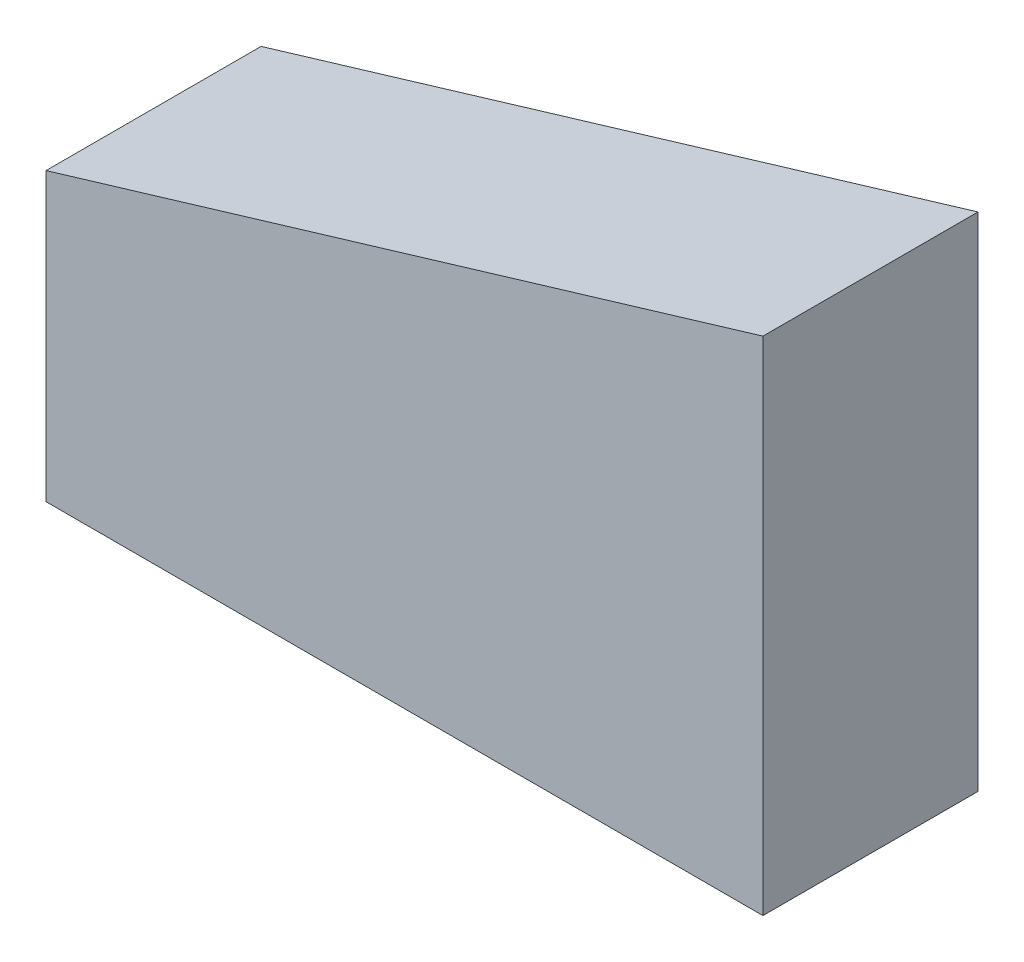
ISO-10303-21;
HEADER;
FILE_DESCRIPTION(('STEP AP214'),'2;1');
FILE_NAME('part.step','',(''),(''),'','','');
FILE_SCHEMA(('AUTOMOTIVE_DESIGN { 1 0 10303 214 1 1 1 1 }'));
ENDSEC;
DATA;
#1=APPLICATION_CONTEXT('core data for automotive mechanical design processes');
#2=APPLICATION_PROTOCOL_DEFINITION('international standard','automotive_design',2000,#1);
#3=PRODUCT_CONTEXT('',#1,'mechanical');
#4=PRODUCT('Part','Part','',(#3));
#5=PRODUCT_RELATED_PRODUCT_CATEGORY('part','',(#4));
#6=PRODUCT_DEFINITION_FORMATION('','',#4);
#7=PRODUCT_DEFINITION_CONTEXT('part definition',#1,'design');
#8=PRODUCT_DEFINITION('design','',#6,#7);
#9=PRODUCT_DEFINITION_SHAPE('','',#8);
#10=(LENGTH_UNIT() NAMED_UNIT(*) SI_UNIT(.MILLI.,.METRE.));
#11=(NAMED_UNIT(*) PLANE_ANGLE_UNIT() SI_UNIT($,.RADIAN.));
#12=(NAMED_UNIT(*) SI_UNIT($,.STERADIAN.) SOLID_ANGLE_UNIT());
#13=UNCERTAINTY_MEASURE_WITH_UNIT(LENGTH_MEASURE(1.E-05),#10,'distance_accuracy_value','');
#14=(GEOMETRIC_REPRESENTATION_CONTEXT(3) GLOBAL_UNCERTAINTY_ASSIGNED_CONTEXT((#13)) GLOBAL_UNIT_ASSIGNED_CONTEXT((#10,
#11,#12)) REPRESENTATION_CONTEXT('',''));
#15=CARTESIAN_POINT('',(0.,0.,0.));
#16=DIRECTION('',(0.,0.,1.));
#17=DIRECTION('',(1.,0.,0.));
#18=AXIS2_PLACEMENT_3D('',#15,#16,#17);
#19=CARTESIAN_POINT('',(-26.8167330677291,-25.3620517928287,19.05));
#20=DIRECTION('',(1.,0.,0.));
#21=DIRECTION('',(0.,0.,-1.));
#22=AXIS2_PLACEMENT_3D('',#19,#20,#21);
#23=PLANE('',#22);
#24=DIRECTION('',(0.,-1.,0.));
#25=VECTOR('',#24,1.);
#26=CARTESIAN_POINT('',(-26.8167330677291,-25.3620517928287,0.));
#27=LINE('',#26,#25);
#28=CARTESIAN_POINT('',(-26.8167330677291,0.0379482071713073,0.));
#29=VERTEX_POINT('',#28);
#30=CARTESIAN_POINT('',(-26.8167330677291,-25.3620517928287,0.));
#31=VERTEX_POINT('',#30);
#32=EDGE_CURVE('E96',#29,#31,#27,.T.);
#33=ORIENTED_EDGE('',*,*,#32,.T.);
#34=DIRECTION('',(0.,0.,-1.));
#35=VECTOR('',#34,1.);
#36=CARTESIAN_POINT('',(-26.8167330677291,-25.3620517928287,19.05));
#37=LINE('',#36,#35);
#38=CARTESIAN_POINT('',(-26.8167330677291,-25.3620517928287,19.05));
#39=VERTEX_POINT('',#38);
#40=EDGE_CURVE('E11',#39,#31,#37,.T.);
#41=ORIENTED_EDGE('',*,*,#40,.F.);
#42=DIRECTION('',(0.,-1.,0.));
#43=VECTOR('',#42,1.);
#44=CARTESIAN_POINT('',(-26.8167330677291,-25.3620517928287,19.05));
#45=LINE('',#44,#43);
#46=CARTESIAN_POINT('',(-26.8167330677291,0.0379482071713073,19.05));
#47=VERTEX_POINT('',#46);
#48=EDGE_CURVE('E84',#47,#39,#45,.T.);
#49=ORIENTED_EDGE('',*,*,#48,.F.);
#50=DIRECTION('',(0.,0.,-1.));
#51=VECTOR('',#50,1.);
#52=CARTESIAN_POINT('',(-26.8167330677291,0.0379482071713073,19.05));
#53=LINE('',#52,#51);
#54=EDGE_CURVE('E92',#47,#29,#53,.T.);
#55=ORIENTED_EDGE('',*,*,#54,.T.);
#56=EDGE_LOOP('',(#33,#41,#49,#55));
#57=FACE_BOUND('',#56,.T.);
#58=ADVANCED_FACE('F33',(#57),#23,.F.);
#59=CARTESIAN_POINT('',(-26.8167330677291,-25.3620517928287,19.05));
#60=DIRECTION('',(0.,1.,0.));
#61=DIRECTION('',(0.,0.,1.));
#62=AXIS2_PLACEMENT_3D('',#59,#60,#61);
#63=PLANE('',#62);
#64=DIRECTION('',(1.,0.,0.));
#65=VECTOR('',#64,1.);
#66=CARTESIAN_POINT('',(-26.8167330677291,-25.3620517928287,0.));
#67=LINE('',#66,#65);
#68=CARTESIAN_POINT('',(36.6832669322709,-25.3620517928287,0.));
#69=VERTEX_POINT('',#68);
#70=EDGE_CURVE('E88',#31,#69,#67,.T.);
#71=ORIENTED_EDGE('',*,*,#70,.T.);
#72=DIRECTION('',(0.,0.,-1.));
#73=VECTOR('',#72,1.);
#74=CARTESIAN_POINT('',(36.6832669322709,-25.3620517928287,19.05));
#75=LINE('',#74,#73);
#76=CARTESIAN_POINT('',(36.6832669322709,-25.3620517928287,19.05));
#77=VERTEX_POINT('',#76);
#78=EDGE_CURVE('E41',#77,#69,#75,.T.);
#79=ORIENTED_EDGE('',*,*,#78,.F.);
#80=DIRECTION('',(1.,0.,0.));
#81=VECTOR('',#80,1.);
#82=CARTESIAN_POINT('',(-26.8167330677291,-25.3620517928287,19.05));
#83=LINE('',#82,#81);
#84=EDGE_CURVE('E79',#39,#77,#83,.T.);
#85=ORIENTED_EDGE('',*,*,#84,.F.);
#86=ORIENTED_EDGE('',*,*,#40,.T.);
#87=EDGE_LOOP('',(#71,#79,#85,#86));
#88=FACE_BOUND('',#87,.T.);
#89=ADVANCED_FACE('F87',(#88),#63,.F.);
#90=CARTESIAN_POINT('',(36.6832669322709,-25.3620517928287,19.05));
#91=DIRECTION('',(-1.,0.,0.));
#92=DIRECTION('',(0.,0.,1.));
#93=AXIS2_PLACEMENT_3D('',#90,#91,#92);
#94=PLANE('',#93);
#95=DIRECTION('',(0.,1.,0.));
#96=VECTOR('',#95,1.);
#97=CARTESIAN_POINT('',(36.6832669322709,-25.3620517928287,0.));
#98=LINE('',#97,#96);
#99=CARTESIAN_POINT('',(36.6832669322709,19.0879482071713,0.));
#100=VERTEX_POINT('',#99);
#101=EDGE_CURVE('E66',#69,#100,#98,.T.);
#102=ORIENTED_EDGE('',*,*,#101,.T.);
#103=DIRECTION('',(0.,0.,-1.));
#104=VECTOR('',#103,1.);
#105=CARTESIAN_POINT('',(36.6832669322709,19.0879482071713,19.05));
#106=LINE('',#105,#104);
#107=CARTESIAN_POINT('',(36.6832669322709,19.0879482071713,19.05));
#108=VERTEX_POINT('',#107);
#109=EDGE_CURVE('E89',#108,#100,#106,.T.);
#110=ORIENTED_EDGE('',*,*,#109,.F.);
#111=DIRECTION('',(0.,1.,0.));
#112=VECTOR('',#111,1.);
#113=CARTESIAN_POINT('',(36.6832669322709,-25.3620517928287,19.05));
#114=LINE('',#113,#112);
#115=EDGE_CURVE('E82',#77,#108,#114,.T.);
#116=ORIENTED_EDGE('',*,*,#115,.F.);
#117=ORIENTED_EDGE('',*,*,#78,.T.);
#118=EDGE_LOOP('',(#102,#110,#116,#117));
#119=FACE_BOUND('',#118,.T.);
#120=ADVANCED_FACE('F90',(#119),#94,.F.);
#121=CARTESIAN_POINT('',(-26.8167330677291,0.0379482071713073,19.05));
#122=DIRECTION('',(0.287347885566345,-0.957826285221151,0.));
#123=DIRECTION('',(0.957826285221151,0.287347885566345,0.));
#124=AXIS2_PLACEMENT_3D('',#121,#122,#123);
#125=PLANE('',#124);
#126=DIRECTION('',(-0.957826285221151,-0.287347885566345,0.));
#127=VECTOR('',#126,1.);
#128=CARTESIAN_POINT('',(-26.8167330677291,0.0379482071713073,0.));
#129=LINE('',#128,#127);
#130=EDGE_CURVE('E72',#100,#29,#129,.T.);
#131=ORIENTED_EDGE('',*,*,#130,.T.);
#132=ORIENTED_EDGE('',*,*,#54,.F.);
#133=DIRECTION('',(-0.957826285221151,-0.287347885566345,0.));
#134=VECTOR('',#133,1.);
#135=CARTESIAN_POINT('',(-26.8167330677291,0.0379482071713073,19.05));
#136=LINE('',#135,#134);
#137=EDGE_CURVE('E49',#108,#47,#136,.T.);
#138=ORIENTED_EDGE('',*,*,#137,.F.);
#139=ORIENTED_EDGE('',*,*,#109,.T.);
#140=EDGE_LOOP('',(#131,#132,#138,#139));
#141=FACE_BOUND('',#140,.T.);
#142=ADVANCED_FACE('F103',(#141),#125,.F.);
#143=CARTESIAN_POINT('',(0.,0.,19.05));
#144=DIRECTION('',(0.,0.,-1.));
#145=DIRECTION('',(-1.,0.,0.));
#146=AXIS2_PLACEMENT_3D('',#143,#144,#145);
#147=PLANE('',#146);
#148=ORIENTED_EDGE('',*,*,#48,.T.);
#149=ORIENTED_EDGE('',*,*,#84,.T.);
#150=ORIENTED_EDGE('',*,*,#115,.T.);
#151=ORIENTED_EDGE('',*,*,#137,.T.);
#152=EDGE_LOOP('',(#148,#149,#150,#151));
#153=FACE_BOUND('',#152,.T.);
#154=ADVANCED_FACE('F80',(#153),#147,.F.);
#155=CARTESIAN_POINT('',(0.,0.,0.));
#156=DIRECTION('',(0.,0.,-1.));
#157=DIRECTION('',(-1.,0.,0.));
#158=AXIS2_PLACEMENT_3D('',#155,#156,#157);
#159=PLANE('',#158);
#160=ORIENTED_EDGE('',*,*,#32,.F.);
#161=ORIENTED_EDGE('',*,*,#130,.F.);
#162=ORIENTED_EDGE('',*,*,#101,.F.);
#163=ORIENTED_EDGE('',*,*,#70,.F.);
#164=EDGE_LOOP('',(#160,#161,#162,#163));
#165=FACE_BOUND('',#164,.T.);
#166=ADVANCED_FACE('F106',(#165),#159,.T.);
#167=CLOSED_SHELL('',(#58,#89,#120,#142,#154,#166));
#168=MANIFOLD_SOLID_BREP('B2',#167);
#169=ADVANCED_BREP_SHAPE_REPRESENTATION('',(#18,#168),#14);
#170=SHAPE_DEFINITION_REPRESENTATION(#9,#169);
ENDSEC;
END-ISO-10303-21;
